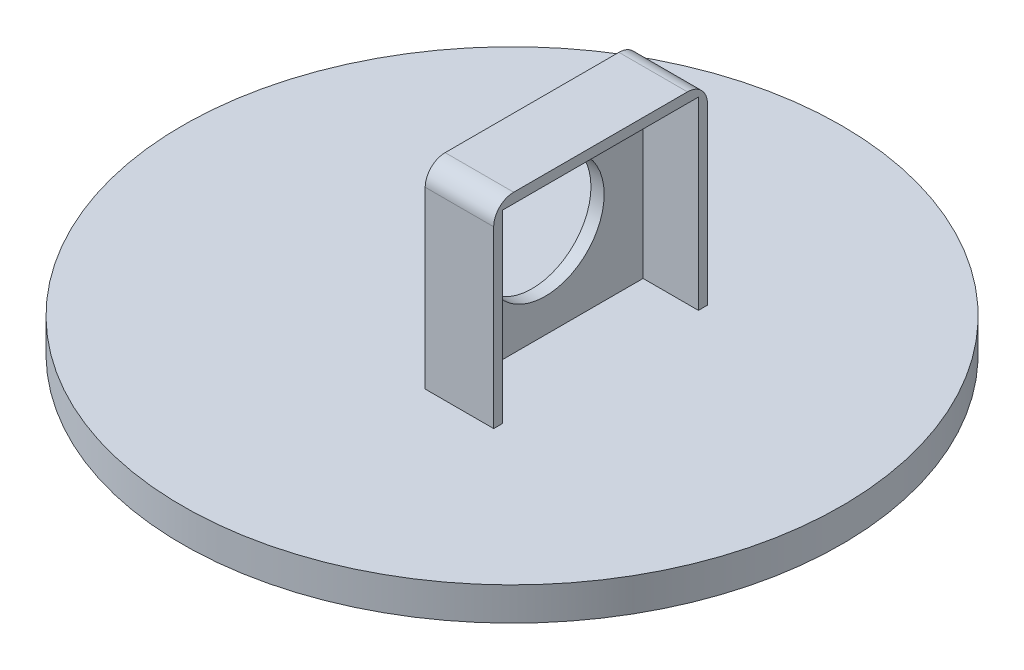
ISO-10303-21;
HEADER;
FILE_DESCRIPTION(('STEP AP214'),'2;1');
FILE_NAME('part.step','',(''),(''),'','','');
FILE_SCHEMA(('AUTOMOTIVE_DESIGN { 1 0 10303 214 1 1 1 1 }'));
ENDSEC;
DATA;
#1=APPLICATION_CONTEXT('core data for automotive mechanical design processes');
#2=APPLICATION_PROTOCOL_DEFINITION('international standard','automotive_design',2000,#1);
#3=PRODUCT_CONTEXT('',#1,'mechanical');
#4=PRODUCT('Part','Part','',(#3));
#5=PRODUCT_RELATED_PRODUCT_CATEGORY('part','',(#4));
#6=PRODUCT_DEFINITION_FORMATION('','',#4);
#7=PRODUCT_DEFINITION_CONTEXT('part definition',#1,'design');
#8=PRODUCT_DEFINITION('design','',#6,#7);
#9=PRODUCT_DEFINITION_SHAPE('','',#8);
#10=(LENGTH_UNIT() NAMED_UNIT(*) SI_UNIT(.MILLI.,.METRE.));
#11=(NAMED_UNIT(*) PLANE_ANGLE_UNIT() SI_UNIT($,.RADIAN.));
#12=(NAMED_UNIT(*) SI_UNIT($,.STERADIAN.) SOLID_ANGLE_UNIT());
#13=UNCERTAINTY_MEASURE_WITH_UNIT(LENGTH_MEASURE(1.E-05),#10,'distance_accuracy_value','');
#14=(GEOMETRIC_REPRESENTATION_CONTEXT(3) GLOBAL_UNCERTAINTY_ASSIGNED_CONTEXT((#13)) GLOBAL_UNIT_ASSIGNED_CONTEXT((#10,
#11,#12)) REPRESENTATION_CONTEXT('',''));
#15=CARTESIAN_POINT('',(0.,0.,0.));
#16=DIRECTION('',(0.,0.,1.));
#17=DIRECTION('',(1.,0.,0.));
#18=AXIS2_PLACEMENT_3D('',#15,#16,#17);
#19=CARTESIAN_POINT('',(0.,16.6,0.));
#20=DIRECTION('',(0.,1.,0.));
#21=DIRECTION('',(0.,0.,1.));
#22=AXIS2_PLACEMENT_3D('',#19,#20,#21);
#23=PLANE('',#22);
#24=CARTESIAN_POINT('',(0.,16.6,-17.25));
#25=DIRECTION('',(0.,-1.,0.));
#26=DIRECTION('',(0.,0.,-1.));
#27=AXIS2_PLACEMENT_3D('',#24,#25,#26);
#28=CIRCLE('',#27,2.);
#29=CARTESIAN_POINT('',(0.,16.6,-19.25));
#30=VERTEX_POINT('',#29);
#31=EDGE_CURVE('E212',#30,#30,#28,.T.);
#32=ORIENTED_EDGE('',*,*,#31,.T.);
#33=EDGE_LOOP('',(#32));
#34=FACE_BOUND('',#33,.T.);
#35=CARTESIAN_POINT('',(0.,16.6,17.25));
#36=DIRECTION('',(0.,-1.,0.));
#37=DIRECTION('',(0.,0.,-1.));
#38=AXIS2_PLACEMENT_3D('',#35,#36,#37);
#39=CIRCLE('',#38,2.);
#40=CARTESIAN_POINT('',(0.,16.6,15.25));
#41=VERTEX_POINT('',#40);
#42=EDGE_CURVE('E218',#41,#41,#39,.T.);
#43=ORIENTED_EDGE('',*,*,#42,.T.);
#44=EDGE_LOOP('',(#43));
#45=FACE_BOUND('',#44,.T.);
#46=CARTESIAN_POINT('',(0.,16.6,0.));
#47=DIRECTION('',(0.,-1.,0.));
#48=DIRECTION('',(0.,0.,-1.));
#49=AXIS2_PLACEMENT_3D('',#46,#47,#48);
#50=CIRCLE('',#49,2.5);
#51=CARTESIAN_POINT('',(0.,16.6,-2.5));
#52=VERTEX_POINT('',#51);
#53=EDGE_CURVE('E229',#52,#52,#50,.T.);
#54=ORIENTED_EDGE('',*,*,#53,.T.);
#55=EDGE_LOOP('',(#54));
#56=FACE_BOUND('',#55,.T.);
#57=CARTESIAN_POINT('',(0.,16.6,0.));
#58=DIRECTION('',(0.,1.,0.));
#59=DIRECTION('',(0.,0.,1.));
#60=AXIS2_PLACEMENT_3D('',#57,#58,#59);
#61=CIRCLE('',#60,165.);
#62=CARTESIAN_POINT('',(0.,16.6,-165.));
#63=VERTEX_POINT('',#62);
#64=EDGE_CURVE('E245',#63,#63,#61,.T.);
#65=ORIENTED_EDGE('',*,*,#64,.T.);
#66=EDGE_LOOP('',(#65));
#67=FACE_BOUND('',#66,.T.);
#68=DIRECTION('',(-1.,0.,0.));
#69=VECTOR('',#68,1.);
#70=CARTESIAN_POINT('',(44.3,16.6,-53.5));
#71=LINE('',#70,#69);
#72=CARTESIAN_POINT('',(44.3,16.6,-53.5));
#73=VERTEX_POINT('',#72);
#74=CARTESIAN_POINT('',(10.,16.6,-53.5));
#75=VERTEX_POINT('',#74);
#76=EDGE_CURVE('E194',#73,#75,#71,.T.);
#77=ORIENTED_EDGE('',*,*,#76,.F.);
#78=DIRECTION('',(0.,0.,-1.));
#79=VECTOR('',#78,1.);
#80=CARTESIAN_POINT('',(44.3,16.6,53.5));
#81=LINE('',#80,#79);
#82=CARTESIAN_POINT('',(44.3,16.6,-49.));
#83=VERTEX_POINT('',#82);
#84=EDGE_CURVE('E183',#83,#73,#81,.T.);
#85=ORIENTED_EDGE('',*,*,#84,.F.);
#86=DIRECTION('',(1.,0.,0.));
#87=VECTOR('',#86,1.);
#88=CARTESIAN_POINT('',(16.6,16.6,-49.));
#89=LINE('',#88,#87);
#90=CARTESIAN_POINT('',(16.6,16.6,-49.));
#91=VERTEX_POINT('',#90);
#92=EDGE_CURVE('E135',#91,#83,#89,.T.);
#93=ORIENTED_EDGE('',*,*,#92,.F.);
#94=DIRECTION('',(0.,0.,-1.));
#95=VECTOR('',#94,1.);
#96=CARTESIAN_POINT('',(16.6,16.6,49.));
#97=LINE('',#96,#95);
#98=CARTESIAN_POINT('',(16.6,16.6,49.));
#99=VERTEX_POINT('',#98);
#100=EDGE_CURVE('E139',#99,#91,#97,.T.);
#101=ORIENTED_EDGE('',*,*,#100,.F.);
#102=DIRECTION('',(1.,0.,0.));
#103=VECTOR('',#102,1.);
#104=CARTESIAN_POINT('',(16.6,16.6,49.));
#105=LINE('',#104,#103);
#106=CARTESIAN_POINT('',(44.3,16.6,49.));
#107=VERTEX_POINT('',#106);
#108=EDGE_CURVE('E123',#99,#107,#105,.T.);
#109=ORIENTED_EDGE('',*,*,#108,.T.);
#110=CARTESIAN_POINT('',(44.3,16.6,53.5));
#111=VERTEX_POINT('',#110);
#112=EDGE_CURVE('E185',#111,#107,#81,.T.);
#113=ORIENTED_EDGE('',*,*,#112,.F.);
#114=DIRECTION('',(-1.,0.,0.));
#115=VECTOR('',#114,1.);
#116=CARTESIAN_POINT('',(44.3,16.6,53.5));
#117=LINE('',#116,#115);
#118=CARTESIAN_POINT('',(10.,16.6,53.5));
#119=VERTEX_POINT('',#118);
#120=EDGE_CURVE('E208',#111,#119,#117,.T.);
#121=ORIENTED_EDGE('',*,*,#120,.T.);
#122=DIRECTION('',(0.,0.,-1.));
#123=VECTOR('',#122,1.);
#124=CARTESIAN_POINT('',(10.,16.6,53.5));
#125=LINE('',#124,#123);
#126=EDGE_CURVE('E197',#119,#75,#125,.T.);
#127=ORIENTED_EDGE('',*,*,#126,.T.);
#128=EDGE_LOOP('',(#77,#85,#93,#101,#109,#113,#121,#127));
#129=FACE_BOUND('',#128,.T.);
#130=ADVANCED_FACE('F43',(#34,#45,#56,#67,#129),#23,.T.);
#131=CARTESIAN_POINT('',(0.,16.6,0.));
#132=DIRECTION('',(0.,-1.,0.));
#133=DIRECTION('',(0.,0.,-1.));
#134=AXIS2_PLACEMENT_3D('',#131,#132,#133);
#135=CYLINDRICAL_SURFACE('',#134,165.);
#136=CARTESIAN_POINT('',(0.,0.,0.));
#137=DIRECTION('',(0.,1.,0.));
#138=DIRECTION('',(0.,0.,1.));
#139=AXIS2_PLACEMENT_3D('',#136,#137,#138);
#140=CIRCLE('',#139,165.);
#141=CARTESIAN_POINT('',(0.,0.,-165.));
#142=VERTEX_POINT('',#141);
#143=EDGE_CURVE('E241',#142,#142,#140,.T.);
#144=CARTESIAN_POINT('',(0.,16.6,-165.));
#145=CARTESIAN_POINT('',(0.,16.4270833333333,-165.));
#146=CARTESIAN_POINT('',(0.,16.2541666666667,-165.));
#147=CARTESIAN_POINT('',(0.,15.9083333333333,-165.));
#148=CARTESIAN_POINT('',(0.,15.7354166666667,-165.));
#149=CARTESIAN_POINT('',(0.,15.3895833333333,-165.));
#150=CARTESIAN_POINT('',(0.,15.2166666666667,-165.));
#151=CARTESIAN_POINT('',(0.,14.8708333333333,-165.));
#152=CARTESIAN_POINT('',(0.,14.6979166666667,-165.));
#153=CARTESIAN_POINT('',(0.,14.3520833333333,-165.));
#154=CARTESIAN_POINT('',(0.,14.1791666666667,-165.));
#155=CARTESIAN_POINT('',(0.,13.8333333333333,-165.));
#156=CARTESIAN_POINT('',(0.,13.6604166666667,-165.));
#157=CARTESIAN_POINT('',(0.,13.3145833333333,-165.));
#158=CARTESIAN_POINT('',(0.,13.1416666666667,-165.));
#159=CARTESIAN_POINT('',(0.,12.7958333333333,-165.));
#160=CARTESIAN_POINT('',(0.,12.6229166666667,-165.));
#161=CARTESIAN_POINT('',(0.,12.2770833333333,-165.));
#162=CARTESIAN_POINT('',(0.,12.1041666666667,-165.));
#163=CARTESIAN_POINT('',(0.,11.7583333333333,-165.));
#164=CARTESIAN_POINT('',(0.,11.5854166666667,-165.));
#165=CARTESIAN_POINT('',(0.,11.2395833333333,-165.));
#166=CARTESIAN_POINT('',(0.,11.0666666666667,-165.));
#167=CARTESIAN_POINT('',(0.,10.7208333333333,-165.));
#168=CARTESIAN_POINT('',(0.,10.5479166666667,-165.));
#169=CARTESIAN_POINT('',(0.,10.2020833333333,-165.));
#170=CARTESIAN_POINT('',(0.,10.0291666666667,-165.));
#171=CARTESIAN_POINT('',(0.,9.68333333333333,-165.));
#172=CARTESIAN_POINT('',(0.,9.51041666666667,-165.));
#173=CARTESIAN_POINT('',(0.,9.16458333333333,-165.));
#174=CARTESIAN_POINT('',(0.,8.99166666666666,-165.));
#175=CARTESIAN_POINT('',(0.,8.64583333333333,-165.));
#176=CARTESIAN_POINT('',(0.,8.47291666666666,-165.));
#177=CARTESIAN_POINT('',(0.,8.12708333333333,-165.));
#178=CARTESIAN_POINT('',(0.,7.95416666666666,-165.));
#179=CARTESIAN_POINT('',(0.,7.60833333333333,-165.));
#180=CARTESIAN_POINT('',(0.,7.43541666666667,-165.));
#181=CARTESIAN_POINT('',(0.,7.08958333333333,-165.));
#182=CARTESIAN_POINT('',(0.,6.91666666666666,-165.));
#183=CARTESIAN_POINT('',(0.,6.57083333333333,-165.));
#184=CARTESIAN_POINT('',(0.,6.39791666666666,-165.));
#185=CARTESIAN_POINT('',(0.,6.05208333333333,-165.));
#186=CARTESIAN_POINT('',(0.,5.87916666666666,-165.));
#187=CARTESIAN_POINT('',(0.,5.53333333333333,-165.));
#188=CARTESIAN_POINT('',(0.,5.36041666666666,-165.));
#189=CARTESIAN_POINT('',(0.,5.01458333333333,-165.));
#190=CARTESIAN_POINT('',(0.,4.84166666666666,-165.));
#191=CARTESIAN_POINT('',(0.,4.49583333333333,-165.));
#192=CARTESIAN_POINT('',(0.,4.32291666666666,-165.));
#193=CARTESIAN_POINT('',(0.,3.97708333333333,-165.));
#194=CARTESIAN_POINT('',(0.,3.80416666666666,-165.));
#195=CARTESIAN_POINT('',(0.,3.45833333333333,-165.));
#196=CARTESIAN_POINT('',(0.,3.28541666666666,-165.));
#197=CARTESIAN_POINT('',(0.,2.93958333333333,-165.));
#198=CARTESIAN_POINT('',(0.,2.76666666666666,-165.));
#199=CARTESIAN_POINT('',(0.,2.42083333333333,-165.));
#200=CARTESIAN_POINT('',(0.,2.24791666666666,-165.));
#201=CARTESIAN_POINT('',(0.,1.90208333333333,-165.));
#202=CARTESIAN_POINT('',(0.,1.72916666666666,-165.));
#203=CARTESIAN_POINT('',(0.,1.38333333333333,-165.));
#204=CARTESIAN_POINT('',(0.,1.21041666666666,-165.));
#205=CARTESIAN_POINT('',(0.,0.864583333333331,-165.));
#206=CARTESIAN_POINT('',(0.,0.691666666666665,-165.));
#207=CARTESIAN_POINT('',(0.,0.345833333333332,-165.));
#208=CARTESIAN_POINT('',(0.,0.172916666666666,-165.));
#209=CARTESIAN_POINT('',(0.,0.,-165.));
#210=B_SPLINE_CURVE_WITH_KNOTS('',3,(#144,#145,#146,#147,#148,#149,#150,#151,#152,#153,#154,
#155,#156,#157,#158,#159,#160,#161,#162,#163,#164,#165,#166,#167,#168,#169,#170,#171,#172,#173,
#174,#175,#176,#177,#178,#179,#180,#181,#182,#183,#184,#185,#186,#187,#188,#189,#190,#191,#192,
#193,#194,#195,#196,#197,#198,#199,#200,#201,#202,#203,#204,#205,#206,#207,#208,#209),
.UNSPECIFIED.,.F.,.F.,(4,2,2,2,2,2,2,2,2,2,2,2,2,2,2,2,2,2,2,2,2,2,2,2,2,2,2,2,2,2,2,2,4),(0.,
0.518750000000002,1.0375,1.55625,2.075,2.59375,3.1125,3.63125,4.15,4.66875,5.1875,5.70625,6.225,
6.74375,7.2625,7.78125,8.3,8.81875,9.3375,9.85625,10.375,10.89375,11.4125,11.93125,12.45,
12.96875,13.4875,14.00625,14.525,15.04375,15.5625,16.08125,16.6),.UNSPECIFIED.);
#211=EDGE_CURVE('BSEAM310',#63,#142,#210,.T.);
#212=ORIENTED_EDGE('',*,*,#64,.F.);
#213=ORIENTED_EDGE('',*,*,#143,.T.);
#214=ORIENTED_EDGE('',*,*,#211,.T.);
#215=ORIENTED_EDGE('',*,*,#211,.F.);
#216=EDGE_LOOP('',(#212,#214,#213,#215));
#217=FACE_BOUND('',#216,.T.);
#218=ADVANCED_FACE('F310',(#217),#135,.T.);
#219=CARTESIAN_POINT('',(0.,0.,0.));
#220=DIRECTION('',(0.,1.,0.));
#221=DIRECTION('',(0.,0.,1.));
#222=AXIS2_PLACEMENT_3D('',#219,#220,#221);
#223=PLANE('',#222);
#224=CARTESIAN_POINT('',(0.,0.,0.));
#225=DIRECTION('',(0.,-1.,0.));
#226=DIRECTION('',(0.,0.,-1.));
#227=AXIS2_PLACEMENT_3D('',#224,#225,#226);
#228=CIRCLE('',#227,30.);
#229=CARTESIAN_POINT('',(0.,0.,-30.));
#230=VERTEX_POINT('',#229);
#231=EDGE_CURVE('E233',#230,#230,#228,.T.);
#232=ORIENTED_EDGE('',*,*,#231,.F.);
#233=EDGE_LOOP('',(#232));
#234=FACE_BOUND('',#233,.T.);
#235=ORIENTED_EDGE('',*,*,#143,.F.);
#236=EDGE_LOOP('',(#235));
#237=FACE_BOUND('',#236,.T.);
#238=ADVANCED_FACE('F316',(#234,#237),#223,.F.);
#239=CARTESIAN_POINT('',(0.,6.6,0.));
#240=DIRECTION('',(0.,-1.,0.));
#241=DIRECTION('',(0.,0.,-1.));
#242=AXIS2_PLACEMENT_3D('',#239,#240,#241);
#243=CYLINDRICAL_SURFACE('',#242,30.);
#244=CARTESIAN_POINT('',(0.,6.6,0.));
#245=DIRECTION('',(0.,-1.,0.));
#246=DIRECTION('',(0.,0.,-1.));
#247=AXIS2_PLACEMENT_3D('',#244,#245,#246);
#248=CIRCLE('',#247,30.);
#249=CARTESIAN_POINT('',(0.,6.6,-30.));
#250=VERTEX_POINT('',#249);
#251=EDGE_CURVE('E237',#250,#250,#248,.T.);
#252=ORIENTED_EDGE('',*,*,#251,.F.);
#253=EDGE_LOOP('',(#252));
#254=FACE_BOUND('',#253,.T.);
#255=ORIENTED_EDGE('',*,*,#231,.T.);
#256=EDGE_LOOP('',(#255));
#257=FACE_BOUND('',#256,.T.);
#258=ADVANCED_FACE('F322',(#254,#257),#243,.F.);
#259=CARTESIAN_POINT('',(0.,6.6,0.));
#260=DIRECTION('',(0.,-1.,0.));
#261=DIRECTION('',(0.,0.,-1.));
#262=AXIS2_PLACEMENT_3D('',#259,#260,#261);
#263=PLANE('',#262);
#264=CARTESIAN_POINT('',(0.,6.6,-17.25));
#265=DIRECTION('',(0.,-1.,0.));
#266=DIRECTION('',(0.,0.,-1.));
#267=AXIS2_PLACEMENT_3D('',#264,#265,#266);
#268=CIRCLE('',#267,2.);
#269=CARTESIAN_POINT('',(0.,6.6,-19.25));
#270=VERTEX_POINT('',#269);
#271=EDGE_CURVE('E222',#270,#270,#268,.T.);
#272=ORIENTED_EDGE('',*,*,#271,.F.);
#273=EDGE_LOOP('',(#272));
#274=FACE_BOUND('',#273,.T.);
#275=CARTESIAN_POINT('',(0.,6.6,17.25));
#276=DIRECTION('',(0.,-1.,0.));
#277=DIRECTION('',(0.,0.,-1.));
#278=AXIS2_PLACEMENT_3D('',#275,#276,#277);
#279=CIRCLE('',#278,2.);
#280=CARTESIAN_POINT('',(0.,6.6,15.25));
#281=VERTEX_POINT('',#280);
#282=EDGE_CURVE('E213',#281,#281,#279,.T.);
#283=ORIENTED_EDGE('',*,*,#282,.F.);
#284=EDGE_LOOP('',(#283));
#285=FACE_BOUND('',#284,.T.);
#286=CARTESIAN_POINT('',(0.,6.6,0.));
#287=DIRECTION('',(0.,-1.,0.));
#288=DIRECTION('',(0.,0.,-1.));
#289=AXIS2_PLACEMENT_3D('',#286,#287,#288);
#290=CIRCLE('',#289,2.5);
#291=CARTESIAN_POINT('',(0.,6.6,-2.5));
#292=VERTEX_POINT('',#291);
#293=EDGE_CURVE('E217',#292,#292,#290,.T.);
#294=ORIENTED_EDGE('',*,*,#293,.F.);
#295=EDGE_LOOP('',(#294));
#296=FACE_BOUND('',#295,.T.);
#297=ORIENTED_EDGE('',*,*,#251,.T.);
#298=EDGE_LOOP('',(#297));
#299=FACE_BOUND('',#298,.T.);
#300=ADVANCED_FACE('F367',(#274,#285,#296,#299),#263,.T.);
#301=CARTESIAN_POINT('',(0.,16.6,0.));
#302=DIRECTION('',(0.,-1.,0.));
#303=DIRECTION('',(0.,0.,-1.));
#304=AXIS2_PLACEMENT_3D('',#301,#302,#303);
#305=CYLINDRICAL_SURFACE('',#304,2.5);
#306=ORIENTED_EDGE('',*,*,#53,.F.);
#307=EDGE_LOOP('',(#306));
#308=FACE_BOUND('',#307,.T.);
#309=ORIENTED_EDGE('',*,*,#293,.T.);
#310=EDGE_LOOP('',(#309));
#311=FACE_BOUND('',#310,.T.);
#312=ADVANCED_FACE('F361',(#308,#311),#305,.F.);
#313=CARTESIAN_POINT('',(0.,16.6,17.25));
#314=DIRECTION('',(0.,-1.,0.));
#315=DIRECTION('',(0.,0.,-1.));
#316=AXIS2_PLACEMENT_3D('',#313,#314,#315);
#317=CYLINDRICAL_SURFACE('',#316,2.);
#318=ORIENTED_EDGE('',*,*,#42,.F.);
#319=EDGE_LOOP('',(#318));
#320=FACE_BOUND('',#319,.T.);
#321=ORIENTED_EDGE('',*,*,#282,.T.);
#322=EDGE_LOOP('',(#321));
#323=FACE_BOUND('',#322,.T.);
#324=ADVANCED_FACE('F358',(#320,#323),#317,.F.);
#325=CARTESIAN_POINT('',(0.,16.6,-17.25));
#326=DIRECTION('',(0.,-1.,0.));
#327=DIRECTION('',(0.,0.,-1.));
#328=AXIS2_PLACEMENT_3D('',#325,#326,#327);
#329=CYLINDRICAL_SURFACE('',#328,2.);
#330=ORIENTED_EDGE('',*,*,#31,.F.);
#331=EDGE_LOOP('',(#330));
#332=FACE_BOUND('',#331,.T.);
#333=ORIENTED_EDGE('',*,*,#271,.T.);
#334=EDGE_LOOP('',(#333));
#335=FACE_BOUND('',#334,.T.);
#336=ADVANCED_FACE('F357',(#332,#335),#329,.F.);
#337=CARTESIAN_POINT('',(44.3,16.6,53.5));
#338=DIRECTION('',(0.,0.,-1.));
#339=DIRECTION('',(0.,1.,0.));
#340=AXIS2_PLACEMENT_3D('',#337,#338,#339);
#341=PLANE('',#340);
#342=DIRECTION('',(0.,-1.,0.));
#343=VECTOR('',#342,1.);
#344=CARTESIAN_POINT('',(44.3,16.6,53.5));
#345=LINE('',#344,#343);
#346=CARTESIAN_POINT('',(44.3,104.1,53.5));
#347=VERTEX_POINT('',#346);
#348=EDGE_CURVE('E180',#347,#111,#345,.T.);
#349=ORIENTED_EDGE('',*,*,#348,.F.);
#350=DIRECTION('',(-1.,0.,0.));
#351=VECTOR('',#350,1.);
#352=CARTESIAN_POINT('',(44.3,104.1,53.5));
#353=LINE('',#352,#351);
#354=CARTESIAN_POINT('',(10.,104.1,53.5));
#355=VERTEX_POINT('',#354);
#356=EDGE_CURVE('E249',#347,#355,#353,.T.);
#357=ORIENTED_EDGE('',*,*,#356,.T.);
#358=DIRECTION('',(0.,-1.,0.));
#359=VECTOR('',#358,1.);
#360=CARTESIAN_POINT('',(10.,16.6,53.5));
#361=LINE('',#360,#359);
#362=EDGE_CURVE('E174',#355,#119,#361,.T.);
#363=ORIENTED_EDGE('',*,*,#362,.T.);
#364=ORIENTED_EDGE('',*,*,#120,.F.);
#365=EDGE_LOOP('',(#349,#357,#363,#364));
#366=FACE_BOUND('',#365,.T.);
#367=ADVANCED_FACE('F279',(#366),#341,.F.);
#368=CARTESIAN_POINT('',(44.3,16.6,-53.5));
#369=DIRECTION('',(0.,0.,1.));
#370=DIRECTION('',(0.,-1.,0.));
#371=AXIS2_PLACEMENT_3D('',#368,#369,#370);
#372=PLANE('',#371);
#373=DIRECTION('',(0.,1.,0.));
#374=VECTOR('',#373,1.);
#375=CARTESIAN_POINT('',(10.,16.6,-53.5));
#376=LINE('',#375,#374);
#377=CARTESIAN_POINT('',(10.,104.1,-53.5));
#378=VERTEX_POINT('',#377);
#379=EDGE_CURVE('E200',#75,#378,#376,.T.);
#380=ORIENTED_EDGE('',*,*,#379,.T.);
#381=DIRECTION('',(-1.,0.,0.));
#382=VECTOR('',#381,1.);
#383=CARTESIAN_POINT('',(44.3,104.1,-53.5));
#384=LINE('',#383,#382);
#385=CARTESIAN_POINT('',(44.3,104.1,-53.5));
#386=VERTEX_POINT('',#385);
#387=EDGE_CURVE('E11',#378,#386,#384,.F.);
#388=ORIENTED_EDGE('',*,*,#387,.T.);
#389=DIRECTION('',(0.,1.,0.));
#390=VECTOR('',#389,1.);
#391=CARTESIAN_POINT('',(44.3,16.6,-53.5));
#392=LINE('',#391,#390);
#393=EDGE_CURVE('E188',#73,#386,#392,.T.);
#394=ORIENTED_EDGE('',*,*,#393,.F.);
#395=ORIENTED_EDGE('',*,*,#76,.T.);
#396=EDGE_LOOP('',(#380,#388,#394,#395));
#397=FACE_BOUND('',#396,.T.);
#398=ADVANCED_FACE('F291',(#397),#372,.F.);
#399=CARTESIAN_POINT('',(44.3,114.1,53.5));
#400=DIRECTION('',(0.,-1.,0.));
#401=DIRECTION('',(0.,0.,-1.));
#402=AXIS2_PLACEMENT_3D('',#399,#400,#401);
#403=PLANE('',#402);
#404=DIRECTION('',(0.,0.,1.));
#405=VECTOR('',#404,1.);
#406=CARTESIAN_POINT('',(10.,114.1,53.5));
#407=LINE('',#406,#405);
#408=CARTESIAN_POINT('',(10.,114.1,-43.5));
#409=VERTEX_POINT('',#408);
#410=CARTESIAN_POINT('',(10.,114.1,43.5));
#411=VERTEX_POINT('',#410);
#412=EDGE_CURVE('E184',#409,#411,#407,.T.);
#413=ORIENTED_EDGE('',*,*,#412,.T.);
#414=DIRECTION('',(-1.,0.,0.));
#415=VECTOR('',#414,1.);
#416=CARTESIAN_POINT('',(44.3,114.1,43.5));
#417=LINE('',#416,#415);
#418=CARTESIAN_POINT('',(44.3,114.1,43.5));
#419=VERTEX_POINT('',#418);
#420=EDGE_CURVE('E65',#411,#419,#417,.F.);
#421=ORIENTED_EDGE('',*,*,#420,.T.);
#422=DIRECTION('',(0.,0.,1.));
#423=VECTOR('',#422,1.);
#424=CARTESIAN_POINT('',(44.3,114.1,53.5));
#425=LINE('',#424,#423);
#426=CARTESIAN_POINT('',(44.3,114.1,-43.5));
#427=VERTEX_POINT('',#426);
#428=EDGE_CURVE('E191',#427,#419,#425,.T.);
#429=ORIENTED_EDGE('',*,*,#428,.F.);
#430=DIRECTION('',(-1.,0.,0.));
#431=VECTOR('',#430,1.);
#432=CARTESIAN_POINT('',(44.3,114.1,-43.5));
#433=LINE('',#432,#431);
#434=EDGE_CURVE('E262',#427,#409,#433,.T.);
#435=ORIENTED_EDGE('',*,*,#434,.T.);
#436=EDGE_LOOP('',(#413,#421,#429,#435));
#437=FACE_BOUND('',#436,.T.);
#438=ADVANCED_FACE('F286',(#437),#403,.F.);
#439=CARTESIAN_POINT('',(44.3,0.,0.));
#440=DIRECTION('',(-1.,0.,0.));
#441=DIRECTION('',(0.,0.,1.));
#442=AXIS2_PLACEMENT_3D('',#439,#440,#441);
#443=PLANE('',#442);
#444=ORIENTED_EDGE('',*,*,#428,.T.);
#445=CARTESIAN_POINT('',(44.3,104.1,43.5));
#446=DIRECTION('',(-1.,0.,0.));
#447=DIRECTION('',(0.,0.,1.));
#448=AXIS2_PLACEMENT_3D('',#445,#446,#447);
#449=CIRCLE('',#448,10.);
#450=EDGE_CURVE('E52',#419,#347,#449,.F.);
#451=ORIENTED_EDGE('',*,*,#450,.T.);
#452=ORIENTED_EDGE('',*,*,#348,.T.);
#453=ORIENTED_EDGE('',*,*,#112,.T.);
#454=DIRECTION('',(0.,-1.,0.));
#455=VECTOR('',#454,1.);
#456=CARTESIAN_POINT('',(44.3,16.6,49.));
#457=LINE('',#456,#455);
#458=CARTESIAN_POINT('',(44.3,109.1,49.));
#459=VERTEX_POINT('',#458);
#460=EDGE_CURVE('E130',#459,#107,#457,.T.);
#461=ORIENTED_EDGE('',*,*,#460,.F.);
#462=DIRECTION('',(0.,0.,1.));
#463=VECTOR('',#462,1.);
#464=CARTESIAN_POINT('',(44.3,109.1,49.));
#465=LINE('',#464,#463);
#466=CARTESIAN_POINT('',(44.3,109.1,-49.));
#467=VERTEX_POINT('',#466);
#468=EDGE_CURVE('E151',#467,#459,#465,.T.);
#469=ORIENTED_EDGE('',*,*,#468,.F.);
#470=DIRECTION('',(0.,1.,0.));
#471=VECTOR('',#470,1.);
#472=CARTESIAN_POINT('',(44.3,16.6,-49.));
#473=LINE('',#472,#471);
#474=EDGE_CURVE('E155',#83,#467,#473,.T.);
#475=ORIENTED_EDGE('',*,*,#474,.F.);
#476=ORIENTED_EDGE('',*,*,#84,.T.);
#477=ORIENTED_EDGE('',*,*,#393,.T.);
#478=CARTESIAN_POINT('',(44.3,104.1,-43.5));
#479=DIRECTION('',(-1.,0.,0.));
#480=DIRECTION('',(0.,0.,1.));
#481=AXIS2_PLACEMENT_3D('',#478,#479,#480);
#482=CIRCLE('',#481,10.);
#483=EDGE_CURVE('E268',#386,#427,#482,.F.);
#484=ORIENTED_EDGE('',*,*,#483,.T.);
#485=EDGE_LOOP('',(#444,#451,#452,#453,#461,#469,#475,#476,#477,#484));
#486=FACE_BOUND('',#485,.T.);
#487=ADVANCED_FACE('F274',(#486),#443,.F.);
#488=CARTESIAN_POINT('',(10.,0.,0.));
#489=DIRECTION('',(-1.,0.,0.));
#490=DIRECTION('',(0.,0.,1.));
#491=AXIS2_PLACEMENT_3D('',#488,#489,#490);
#492=PLANE('',#491);
#493=CARTESIAN_POINT('',(10.,62.85,0.));
#494=DIRECTION('',(1.,0.,0.));
#495=DIRECTION('',(0.,0.,-1.));
#496=AXIS2_PLACEMENT_3D('',#493,#494,#495);
#497=CIRCLE('',#496,29.5);
#498=CARTESIAN_POINT('',(10.,62.85,-29.5));
#499=VERTEX_POINT('',#498);
#500=EDGE_CURVE('E167',#499,#499,#497,.T.);
#501=ORIENTED_EDGE('',*,*,#500,.T.);
#502=EDGE_LOOP('',(#501));
#503=FACE_BOUND('',#502,.T.);
#504=ORIENTED_EDGE('',*,*,#362,.F.);
#505=CARTESIAN_POINT('',(10.,104.1,43.5));
#506=DIRECTION('',(-1.,0.,0.));
#507=DIRECTION('',(0.,0.,1.));
#508=AXIS2_PLACEMENT_3D('',#505,#506,#507);
#509=CIRCLE('',#508,10.);
#510=EDGE_CURVE('E259',#355,#411,#509,.T.);
#511=ORIENTED_EDGE('',*,*,#510,.T.);
#512=ORIENTED_EDGE('',*,*,#412,.F.);
#513=CARTESIAN_POINT('',(10.,104.1,-43.5));
#514=DIRECTION('',(-1.,0.,0.));
#515=DIRECTION('',(0.,0.,1.));
#516=AXIS2_PLACEMENT_3D('',#513,#514,#515);
#517=CIRCLE('',#516,10.);
#518=EDGE_CURVE('E256',#409,#378,#517,.T.);
#519=ORIENTED_EDGE('',*,*,#518,.T.);
#520=ORIENTED_EDGE('',*,*,#379,.F.);
#521=ORIENTED_EDGE('',*,*,#126,.F.);
#522=EDGE_LOOP('',(#504,#511,#512,#519,#520,#521));
#523=FACE_BOUND('',#522,.T.);
#524=ADVANCED_FACE('F284',(#503,#523),#492,.T.);
#525=CARTESIAN_POINT('',(16.6,16.6,49.));
#526=DIRECTION('',(0.,0.,1.));
#527=DIRECTION('',(1.,0.,0.));
#528=AXIS2_PLACEMENT_3D('',#525,#526,#527);
#529=PLANE('',#528);
#530=ORIENTED_EDGE('',*,*,#460,.T.);
#531=ORIENTED_EDGE('',*,*,#108,.F.);
#532=DIRECTION('',(0.,-1.,0.));
#533=VECTOR('',#532,1.);
#534=CARTESIAN_POINT('',(16.6,16.6,49.));
#535=LINE('',#534,#533);
#536=CARTESIAN_POINT('',(16.6,109.1,49.));
#537=VERTEX_POINT('',#536);
#538=EDGE_CURVE('E127',#537,#99,#535,.T.);
#539=ORIENTED_EDGE('',*,*,#538,.F.);
#540=DIRECTION('',(1.,0.,0.));
#541=VECTOR('',#540,1.);
#542=CARTESIAN_POINT('',(16.6,109.1,49.));
#543=LINE('',#542,#541);
#544=EDGE_CURVE('E171',#537,#459,#543,.T.);
#545=ORIENTED_EDGE('',*,*,#544,.T.);
#546=EDGE_LOOP('',(#530,#531,#539,#545));
#547=FACE_BOUND('',#546,.T.);
#548=ADVANCED_FACE('F125',(#547),#529,.F.);
#549=CARTESIAN_POINT('',(16.6,109.1,49.));
#550=DIRECTION('',(0.,1.,0.));
#551=DIRECTION('',(0.,0.,1.));
#552=AXIS2_PLACEMENT_3D('',#549,#550,#551);
#553=PLANE('',#552);
#554=ORIENTED_EDGE('',*,*,#468,.T.);
#555=ORIENTED_EDGE('',*,*,#544,.F.);
#556=DIRECTION('',(0.,0.,1.));
#557=VECTOR('',#556,1.);
#558=CARTESIAN_POINT('',(16.6,109.1,49.));
#559=LINE('',#558,#557);
#560=CARTESIAN_POINT('',(16.6,109.1,-49.));
#561=VERTEX_POINT('',#560);
#562=EDGE_CURVE('E136',#561,#537,#559,.T.);
#563=ORIENTED_EDGE('',*,*,#562,.F.);
#564=DIRECTION('',(1.,0.,0.));
#565=VECTOR('',#564,1.);
#566=CARTESIAN_POINT('',(16.6,109.1,-49.));
#567=LINE('',#566,#565);
#568=EDGE_CURVE('E175',#561,#467,#567,.T.);
#569=ORIENTED_EDGE('',*,*,#568,.T.);
#570=EDGE_LOOP('',(#554,#555,#563,#569));
#571=FACE_BOUND('',#570,.T.);
#572=ADVANCED_FACE('F295',(#571),#553,.F.);
#573=CARTESIAN_POINT('',(16.6,16.6,-49.));
#574=DIRECTION('',(0.,0.,-1.));
#575=DIRECTION('',(-1.,0.,0.));
#576=AXIS2_PLACEMENT_3D('',#573,#574,#575);
#577=PLANE('',#576);
#578=ORIENTED_EDGE('',*,*,#474,.T.);
#579=ORIENTED_EDGE('',*,*,#568,.F.);
#580=DIRECTION('',(0.,1.,0.));
#581=VECTOR('',#580,1.);
#582=CARTESIAN_POINT('',(16.6,16.6,-49.));
#583=LINE('',#582,#581);
#584=EDGE_CURVE('E146',#91,#561,#583,.T.);
#585=ORIENTED_EDGE('',*,*,#584,.F.);
#586=ORIENTED_EDGE('',*,*,#92,.T.);
#587=EDGE_LOOP('',(#578,#579,#585,#586));
#588=FACE_BOUND('',#587,.T.);
#589=ADVANCED_FACE('F297',(#588),#577,.F.);
#590=CARTESIAN_POINT('',(16.6,0.,0.));
#591=DIRECTION('',(-1.,0.,0.));
#592=DIRECTION('',(0.,0.,1.));
#593=AXIS2_PLACEMENT_3D('',#590,#591,#592);
#594=PLANE('',#593);
#595=CARTESIAN_POINT('',(16.6,62.85,0.));
#596=DIRECTION('',(1.,0.,0.));
#597=DIRECTION('',(0.,0.,-1.));
#598=AXIS2_PLACEMENT_3D('',#595,#596,#597);
#599=CIRCLE('',#598,29.5);
#600=CARTESIAN_POINT('',(16.6,62.85,-29.5));
#601=VERTEX_POINT('',#600);
#602=EDGE_CURVE('E158',#601,#601,#599,.T.);
#603=ORIENTED_EDGE('',*,*,#602,.F.);
#604=EDGE_LOOP('',(#603));
#605=FACE_BOUND('',#604,.T.);
#606=ORIENTED_EDGE('',*,*,#538,.T.);
#607=ORIENTED_EDGE('',*,*,#100,.T.);
#608=ORIENTED_EDGE('',*,*,#584,.T.);
#609=ORIENTED_EDGE('',*,*,#562,.T.);
#610=EDGE_LOOP('',(#606,#607,#608,#609));
#611=FACE_BOUND('',#610,.T.);
#612=ADVANCED_FACE('F148',(#605,#611),#594,.F.);
#613=CARTESIAN_POINT('',(10.,62.85,0.));
#614=DIRECTION('',(1.,0.,0.));
#615=DIRECTION('',(0.,0.,-1.));
#616=AXIS2_PLACEMENT_3D('',#613,#614,#615);
#617=CYLINDRICAL_SURFACE('',#616,29.5);
#618=ORIENTED_EDGE('',*,*,#500,.F.);
#619=EDGE_LOOP('',(#618));
#620=FACE_BOUND('',#619,.T.);
#621=ORIENTED_EDGE('',*,*,#602,.T.);
#622=EDGE_LOOP('',(#621));
#623=FACE_BOUND('',#622,.T.);
#624=ADVANCED_FACE('F304',(#620,#623),#617,.F.);
#625=CARTESIAN_POINT('',(44.3,104.1,43.5));
#626=DIRECTION('',(-1.,0.,0.));
#627=DIRECTION('',(0.,0.,1.));
#628=AXIS2_PLACEMENT_3D('',#625,#626,#627);
#629=CYLINDRICAL_SURFACE('',#628,10.);
#630=ORIENTED_EDGE('',*,*,#450,.F.);
#631=ORIENTED_EDGE('',*,*,#420,.F.);
#632=ORIENTED_EDGE('',*,*,#510,.F.);
#633=ORIENTED_EDGE('',*,*,#356,.F.);
#634=EDGE_LOOP('',(#630,#631,#632,#633));
#635=FACE_BOUND('',#634,.T.);
#636=ADVANCED_FACE('F281',(#635),#629,.T.);
#637=CARTESIAN_POINT('',(44.3,104.1,-43.5));
#638=DIRECTION('',(-1.,0.,0.));
#639=DIRECTION('',(0.,0.,1.));
#640=AXIS2_PLACEMENT_3D('',#637,#638,#639);
#641=CYLINDRICAL_SURFACE('',#640,10.);
#642=ORIENTED_EDGE('',*,*,#483,.F.);
#643=ORIENTED_EDGE('',*,*,#387,.F.);
#644=ORIENTED_EDGE('',*,*,#518,.F.);
#645=ORIENTED_EDGE('',*,*,#434,.F.);
#646=EDGE_LOOP('',(#642,#643,#644,#645));
#647=FACE_BOUND('',#646,.T.);
#648=ADVANCED_FACE('F45',(#647),#641,.T.);
#649=CLOSED_SHELL('',(#130,#218,#238,#258,#300,#312,#324,#336,#367,#398,#438,#487,#524,#548,
#572,#589,#612,#624,#636,#648));
#650=MANIFOLD_SOLID_BREP('B2',#649);
#651=ADVANCED_BREP_SHAPE_REPRESENTATION('',(#18,#650),#14);
#652=SHAPE_DEFINITION_REPRESENTATION(#9,#651);
ENDSEC;
END-ISO-10303-21;
